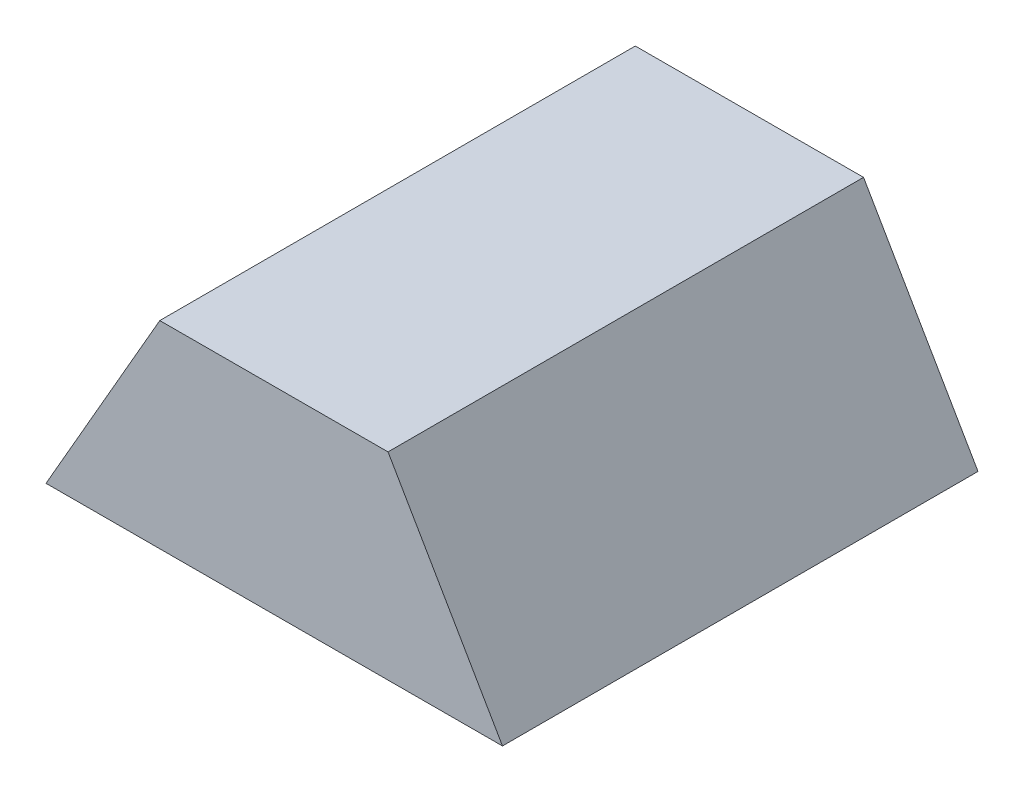
ISO-10303-21;
HEADER;
FILE_DESCRIPTION(('STEP AP214'),'2;1');
FILE_NAME('part.step','',(''),(''),'','','');
FILE_SCHEMA(('AUTOMOTIVE_DESIGN { 1 0 10303 214 1 1 1 1 }'));
ENDSEC;
DATA;
#1=APPLICATION_CONTEXT('core data for automotive mechanical design processes');
#2=APPLICATION_PROTOCOL_DEFINITION('international standard','automotive_design',2000,#1);
#3=PRODUCT_CONTEXT('',#1,'mechanical');
#4=PRODUCT('Part','Part','',(#3));
#5=PRODUCT_RELATED_PRODUCT_CATEGORY('part','',(#4));
#6=PRODUCT_DEFINITION_FORMATION('','',#4);
#7=PRODUCT_DEFINITION_CONTEXT('part definition',#1,'design');
#8=PRODUCT_DEFINITION('design','',#6,#7);
#9=PRODUCT_DEFINITION_SHAPE('','',#8);
#10=(LENGTH_UNIT() NAMED_UNIT(*) SI_UNIT(.MILLI.,.METRE.));
#11=(NAMED_UNIT(*) PLANE_ANGLE_UNIT() SI_UNIT($,.RADIAN.));
#12=(NAMED_UNIT(*) SI_UNIT($,.STERADIAN.) SOLID_ANGLE_UNIT());
#13=UNCERTAINTY_MEASURE_WITH_UNIT(LENGTH_MEASURE(1.E-05),#10,'distance_accuracy_value','');
#14=(GEOMETRIC_REPRESENTATION_CONTEXT(3) GLOBAL_UNCERTAINTY_ASSIGNED_CONTEXT((#13)) GLOBAL_UNIT_ASSIGNED_CONTEXT((#10,
#11,#12)) REPRESENTATION_CONTEXT('',''));
#15=CARTESIAN_POINT('',(0.,0.,0.));
#16=DIRECTION('',(0.,0.,1.));
#17=DIRECTION('',(1.,0.,0.));
#18=AXIS2_PLACEMENT_3D('',#15,#16,#17);
#19=CARTESIAN_POINT('',(24.,0.0411216211915623,50.));
#20=DIRECTION('',(-0.865167433389441,-0.501483112579404,0.));
#21=DIRECTION('',(0.501483112579404,-0.865167433389441,0.));
#22=AXIS2_PLACEMENT_3D('',#19,#20,#21);
#23=PLANE('',#22);
#24=DIRECTION('',(-0.501483112579404,0.865167433389441,0.));
#25=VECTOR('',#24,1.);
#26=CARTESIAN_POINT('',(24.,0.0411216211915623,0.));
#27=LINE('',#26,#25);
#28=CARTESIAN_POINT('',(24.,0.0411216211915623,0.));
#29=VERTEX_POINT('',#28);
#30=CARTESIAN_POINT('',(11.9643876314033,20.8051705014223,0.));
#31=VERTEX_POINT('',#30);
#32=EDGE_CURVE('E96',#29,#31,#27,.T.);
#33=ORIENTED_EDGE('',*,*,#32,.T.);
#34=DIRECTION('',(0.,0.,-1.));
#35=VECTOR('',#34,1.);
#36=CARTESIAN_POINT('',(11.9643876314033,20.8051705014223,50.));
#37=LINE('',#36,#35);
#38=CARTESIAN_POINT('',(11.9643876314033,20.8051705014223,50.));
#39=VERTEX_POINT('',#38);
#40=EDGE_CURVE('E11',#39,#31,#37,.T.);
#41=ORIENTED_EDGE('',*,*,#40,.F.);
#42=DIRECTION('',(-0.501483112579404,0.865167433389441,0.));
#43=VECTOR('',#42,1.);
#44=CARTESIAN_POINT('',(24.,0.0411216211915623,50.));
#45=LINE('',#44,#43);
#46=CARTESIAN_POINT('',(24.,0.0411216211915623,50.));
#47=VERTEX_POINT('',#46);
#48=EDGE_CURVE('E84',#47,#39,#45,.T.);
#49=ORIENTED_EDGE('',*,*,#48,.F.);
#50=DIRECTION('',(0.,0.,-1.));
#51=VECTOR('',#50,1.);
#52=CARTESIAN_POINT('',(24.,0.0411216211915623,50.));
#53=LINE('',#52,#51);
#54=EDGE_CURVE('E92',#47,#29,#53,.T.);
#55=ORIENTED_EDGE('',*,*,#54,.T.);
#56=EDGE_LOOP('',(#33,#41,#49,#55));
#57=FACE_BOUND('',#56,.T.);
#58=ADVANCED_FACE('F33',(#57),#23,.F.);
#59=CARTESIAN_POINT('',(11.9643876314033,20.8051705014223,50.));
#60=DIRECTION('',(0.0017133983679353,-0.999998532131939,0.));
#61=DIRECTION('',(0.999998532131939,0.0017133983679353,0.));
#62=AXIS2_PLACEMENT_3D('',#59,#60,#61);
#63=PLANE('',#62);
#64=DIRECTION('',(-0.999998532131939,-0.0017133983679353,0.));
#65=VECTOR('',#64,1.);
#66=CARTESIAN_POINT('',(11.9643876314033,20.8051705014223,0.));
#67=LINE('',#66,#65);
#68=CARTESIAN_POINT('',(-12.0356123685967,20.7640488802307,0.));
#69=VERTEX_POINT('',#68);
#70=EDGE_CURVE('E88',#31,#69,#67,.T.);
#71=ORIENTED_EDGE('',*,*,#70,.T.);
#72=DIRECTION('',(0.,0.,-1.));
#73=VECTOR('',#72,1.);
#74=CARTESIAN_POINT('',(-12.0356123685967,20.7640488802307,50.));
#75=LINE('',#74,#73);
#76=CARTESIAN_POINT('',(-12.0356123685967,20.7640488802307,50.));
#77=VERTEX_POINT('',#76);
#78=EDGE_CURVE('E41',#77,#69,#75,.T.);
#79=ORIENTED_EDGE('',*,*,#78,.F.);
#80=DIRECTION('',(-0.999998532131939,-0.0017133983679353,0.));
#81=VECTOR('',#80,1.);
#82=CARTESIAN_POINT('',(11.9643876314033,20.8051705014223,50.));
#83=LINE('',#82,#81);
#84=EDGE_CURVE('E79',#39,#77,#83,.T.);
#85=ORIENTED_EDGE('',*,*,#84,.F.);
#86=ORIENTED_EDGE('',*,*,#40,.T.);
#87=EDGE_LOOP('',(#71,#79,#85,#86));
#88=FACE_BOUND('',#87,.T.);
#89=ADVANCED_FACE('F87',(#88),#63,.F.);
#90=CARTESIAN_POINT('',(-12.0356123685967,20.7640488802307,50.));
#91=DIRECTION('',(0.866880831757376,-0.498515419552535,0.));
#92=DIRECTION('',(0.498515419552535,0.866880831757376,0.));
#93=AXIS2_PLACEMENT_3D('',#90,#91,#92);
#94=PLANE('',#93);
#95=DIRECTION('',(-0.498515419552535,-0.866880831757376,0.));
#96=VECTOR('',#95,1.);
#97=CARTESIAN_POINT('',(-12.0356123685967,20.7640488802307,0.));
#98=LINE('',#97,#96);
#99=CARTESIAN_POINT('',(-24.,-0.0411216211915629,0.));
#100=VERTEX_POINT('',#99);
#101=EDGE_CURVE('E66',#69,#100,#98,.T.);
#102=ORIENTED_EDGE('',*,*,#101,.T.);
#103=DIRECTION('',(0.,0.,-1.));
#104=VECTOR('',#103,1.);
#105=CARTESIAN_POINT('',(-24.,-0.0411216211915629,50.));
#106=LINE('',#105,#104);
#107=CARTESIAN_POINT('',(-24.,-0.0411216211915629,50.));
#108=VERTEX_POINT('',#107);
#109=EDGE_CURVE('E89',#108,#100,#106,.T.);
#110=ORIENTED_EDGE('',*,*,#109,.F.);
#111=DIRECTION('',(-0.498515419552535,-0.866880831757376,0.));
#112=VECTOR('',#111,1.);
#113=CARTESIAN_POINT('',(-12.0356123685967,20.7640488802307,50.));
#114=LINE('',#113,#112);
#115=EDGE_CURVE('E82',#77,#108,#114,.T.);
#116=ORIENTED_EDGE('',*,*,#115,.F.);
#117=ORIENTED_EDGE('',*,*,#78,.T.);
#118=EDGE_LOOP('',(#102,#110,#116,#117));
#119=FACE_BOUND('',#118,.T.);
#120=ADVANCED_FACE('F90',(#119),#94,.F.);
#121=CARTESIAN_POINT('',(-24.,-0.0411216211915629,50.));
#122=DIRECTION('',(-0.00171339836793534,0.999998532131939,0.));
#123=DIRECTION('',(-0.999998532131939,-0.00171339836793534,0.));
#124=AXIS2_PLACEMENT_3D('',#121,#122,#123);
#125=PLANE('',#124);
#126=DIRECTION('',(0.999998532131939,0.00171339836793534,0.));
#127=VECTOR('',#126,1.);
#128=CARTESIAN_POINT('',(-24.,-0.0411216211915629,0.));
#129=LINE('',#128,#127);
#130=EDGE_CURVE('E72',#100,#29,#129,.T.);
#131=ORIENTED_EDGE('',*,*,#130,.T.);
#132=ORIENTED_EDGE('',*,*,#54,.F.);
#133=DIRECTION('',(0.999998532131939,0.00171339836793534,0.));
#134=VECTOR('',#133,1.);
#135=CARTESIAN_POINT('',(-24.,-0.0411216211915629,50.));
#136=LINE('',#135,#134);
#137=EDGE_CURVE('E49',#108,#47,#136,.T.);
#138=ORIENTED_EDGE('',*,*,#137,.F.);
#139=ORIENTED_EDGE('',*,*,#109,.T.);
#140=EDGE_LOOP('',(#131,#132,#138,#139));
#141=FACE_BOUND('',#140,.T.);
#142=ADVANCED_FACE('F104',(#141),#125,.F.);
#143=CARTESIAN_POINT('',(0.,0.,50.));
#144=DIRECTION('',(0.,0.,1.));
#145=DIRECTION('',(1.,0.,0.));
#146=AXIS2_PLACEMENT_3D('',#143,#144,#145);
#147=PLANE('',#146);
#148=ORIENTED_EDGE('',*,*,#48,.T.);
#149=ORIENTED_EDGE('',*,*,#84,.T.);
#150=ORIENTED_EDGE('',*,*,#115,.T.);
#151=ORIENTED_EDGE('',*,*,#137,.T.);
#152=EDGE_LOOP('',(#148,#149,#150,#151));
#153=FACE_BOUND('',#152,.T.);
#154=ADVANCED_FACE('F80',(#153),#147,.T.);
#155=CARTESIAN_POINT('',(0.,0.,0.));
#156=DIRECTION('',(0.,0.,1.));
#157=DIRECTION('',(1.,0.,0.));
#158=AXIS2_PLACEMENT_3D('',#155,#156,#157);
#159=PLANE('',#158);
#160=CARTESIAN_POINT('',(0.,9.93304871448665,0.));
#161=DIRECTION('',(0.,0.,-1.));
#162=DIRECTION('',(-1.,0.,0.));
#163=AXIS2_PLACEMENT_3D('',#160,#161,#162);
#164=CIRCLE('',#163,5.);
#165=CARTESIAN_POINT('',(-5.,9.93304871448665,0.));
#166=VERTEX_POINT('',#165);
#167=EDGE_CURVE('E110',#166,#166,#164,.T.);
#168=ORIENTED_EDGE('',*,*,#167,.F.);
#169=EDGE_LOOP('',(#168));
#170=FACE_BOUND('',#169,.T.);
#171=ORIENTED_EDGE('',*,*,#32,.F.);
#172=ORIENTED_EDGE('',*,*,#130,.F.);
#173=ORIENTED_EDGE('',*,*,#101,.F.);
#174=ORIENTED_EDGE('',*,*,#70,.F.);
#175=EDGE_LOOP('',(#171,#172,#173,#174));
#176=FACE_BOUND('',#175,.T.);
#177=ADVANCED_FACE('F107',(#170,#176),#159,.F.);
#178=CARTESIAN_POINT('',(0.,9.93304871448665,10.));
#179=DIRECTION('',(0.,0.,-1.));
#180=DIRECTION('',(-1.,0.,0.));
#181=AXIS2_PLACEMENT_3D('',#178,#179,#180);
#182=CYLINDRICAL_SURFACE('',#181,5.);
#183=CARTESIAN_POINT('',(0.,9.93304871448665,10.));
#184=DIRECTION('',(0.,0.,-1.));
#185=DIRECTION('',(-1.,0.,0.));
#186=AXIS2_PLACEMENT_3D('',#183,#184,#185);
#187=CIRCLE('',#186,5.);
#188=CARTESIAN_POINT('',(-5.,9.93304871448665,10.));
#189=VERTEX_POINT('',#188);
#190=EDGE_CURVE('E99',#189,#189,#187,.T.);
#191=ORIENTED_EDGE('',*,*,#190,.F.);
#192=EDGE_LOOP('',(#191));
#193=FACE_BOUND('',#192,.T.);
#194=ORIENTED_EDGE('',*,*,#167,.T.);
#195=EDGE_LOOP('',(#194));
#196=FACE_BOUND('',#195,.T.);
#197=ADVANCED_FACE('F118',(#193,#196),#182,.F.);
#198=CARTESIAN_POINT('',(0.,9.93304871448665,10.));
#199=DIRECTION('',(0.,0.,-1.));
#200=DIRECTION('',(-1.,0.,0.));
#201=AXIS2_PLACEMENT_3D('',#198,#199,#200);
#202=PLANE('',#201);
#203=ORIENTED_EDGE('',*,*,#190,.T.);
#204=EDGE_LOOP('',(#203));
#205=FACE_BOUND('',#204,.T.);
#206=ADVANCED_FACE('F116',(#205),#202,.T.);
#207=CLOSED_SHELL('',(#58,#89,#120,#142,#154,#177,#197,#206));
#208=MANIFOLD_SOLID_BREP('B2',#207);
#209=ADVANCED_BREP_SHAPE_REPRESENTATION('',(#18,#208),#14);
#210=SHAPE_DEFINITION_REPRESENTATION(#9,#209);
ENDSEC;
END-ISO-10303-21;
